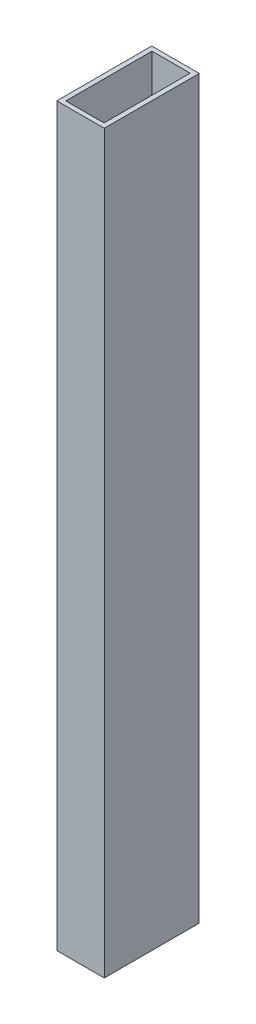
ISO-10303-21;
HEADER;
FILE_DESCRIPTION(('STEP AP214'),'2;1');
FILE_NAME('part.step','',(''),(''),'','','');
FILE_SCHEMA(('AUTOMOTIVE_DESIGN { 1 0 10303 214 1 1 1 1 }'));
ENDSEC;
DATA;
#1=APPLICATION_CONTEXT('core data for automotive mechanical design processes');
#2=APPLICATION_PROTOCOL_DEFINITION('international standard','automotive_design',2000,#1);
#3=PRODUCT_CONTEXT('',#1,'mechanical');
#4=PRODUCT('Part','Part','',(#3));
#5=PRODUCT_RELATED_PRODUCT_CATEGORY('part','',(#4));
#6=PRODUCT_DEFINITION_FORMATION('','',#4);
#7=PRODUCT_DEFINITION_CONTEXT('part definition',#1,'design');
#8=PRODUCT_DEFINITION('design','',#6,#7);
#9=PRODUCT_DEFINITION_SHAPE('','',#8);
#10=(LENGTH_UNIT() NAMED_UNIT(*) SI_UNIT(.MILLI.,.METRE.));
#11=(NAMED_UNIT(*) PLANE_ANGLE_UNIT() SI_UNIT($,.RADIAN.));
#12=(NAMED_UNIT(*) SI_UNIT($,.STERADIAN.) SOLID_ANGLE_UNIT());
#13=UNCERTAINTY_MEASURE_WITH_UNIT(LENGTH_MEASURE(1.E-05),#10,'distance_accuracy_value','');
#14=(GEOMETRIC_REPRESENTATION_CONTEXT(3) GLOBAL_UNCERTAINTY_ASSIGNED_CONTEXT((#13)) GLOBAL_UNIT_ASSIGNED_CONTEXT((#10,
#11,#12)) REPRESENTATION_CONTEXT('',''));
#15=CARTESIAN_POINT('',(0.,0.,0.));
#16=DIRECTION('',(0.,0.,1.));
#17=DIRECTION('',(1.,0.,0.));
#18=AXIS2_PLACEMENT_3D('',#15,#16,#17);
#19=CARTESIAN_POINT('',(0.,393.7,0.));
#20=DIRECTION('',(0.,-1.,0.));
#21=DIRECTION('',(0.,0.,-1.));
#22=AXIS2_PLACEMENT_3D('',#19,#20,#21);
#23=PLANE('',#22);
#24=DIRECTION('',(0.,0.,-1.));
#25=VECTOR('',#24,1.);
#26=CARTESIAN_POINT('',(15.4285360824743,393.7,25.104006109202));
#27=LINE('',#26,#25);
#28=CARTESIAN_POINT('',(15.4285360824743,393.7,25.104006109202));
#29=VERTEX_POINT('',#28);
#30=CARTESIAN_POINT('',(15.4285360824743,393.7,-25.695993890798));
#31=VERTEX_POINT('',#30);
#32=EDGE_CURVE('E136',#29,#31,#27,.T.);
#33=ORIENTED_EDGE('',*,*,#32,.T.);
#34=DIRECTION('',(-1.,0.,0.));
#35=VECTOR('',#34,1.);
#36=CARTESIAN_POINT('',(-9.97146391752574,393.7,-25.695993890798));
#37=LINE('',#36,#35);
#38=CARTESIAN_POINT('',(-9.97146391752574,393.7,-25.695993890798));
#39=VERTEX_POINT('',#38);
#40=EDGE_CURVE('E139',#31,#39,#37,.T.);
#41=ORIENTED_EDGE('',*,*,#40,.T.);
#42=DIRECTION('',(0.,0.,1.));
#43=VECTOR('',#42,1.);
#44=CARTESIAN_POINT('',(-9.97146391752574,393.7,25.104006109202));
#45=LINE('',#44,#43);
#46=CARTESIAN_POINT('',(-9.97146391752574,393.7,25.104006109202));
#47=VERTEX_POINT('',#46);
#48=EDGE_CURVE('E142',#39,#47,#45,.T.);
#49=ORIENTED_EDGE('',*,*,#48,.T.);
#50=DIRECTION('',(1.,0.,0.));
#51=VECTOR('',#50,1.);
#52=CARTESIAN_POINT('',(-9.97146391752574,393.7,25.104006109202));
#53=LINE('',#52,#51);
#54=EDGE_CURVE('E144',#47,#29,#53,.T.);
#55=ORIENTED_EDGE('',*,*,#54,.T.);
#56=EDGE_LOOP('',(#33,#41,#49,#55));
#57=FACE_BOUND('',#56,.T.);
#58=DIRECTION('',(0.,0.,-1.));
#59=VECTOR('',#58,1.);
#60=CARTESIAN_POINT('',(12.9079329813631,393.7,0.));
#61=LINE('',#60,#59);
#62=CARTESIAN_POINT('',(12.9079329813631,393.7,22.7317882900888));
#63=VERTEX_POINT('',#62);
#64=CARTESIAN_POINT('',(12.9079329813631,393.7,-23.3858455277616));
#65=VERTEX_POINT('',#64);
#66=EDGE_CURVE('E103',#63,#65,#61,.T.);
#67=ORIENTED_EDGE('',*,*,#66,.F.);
#68=DIRECTION('',(1.,0.,0.));
#69=VECTOR('',#68,1.);
#70=CARTESIAN_POINT('',(0.,393.7,22.7317882900888));
#71=LINE('',#70,#69);
#72=CARTESIAN_POINT('',(-7.51293012600225,393.7,22.7317882900888));
#73=VERTEX_POINT('',#72);
#74=EDGE_CURVE('E106',#73,#63,#71,.T.);
#75=ORIENTED_EDGE('',*,*,#74,.F.);
#76=DIRECTION('',(0.,0.,1.));
#77=VECTOR('',#76,1.);
#78=CARTESIAN_POINT('',(-7.51293012600225,393.7,0.));
#79=LINE('',#78,#77);
#80=CARTESIAN_POINT('',(-7.51293012600225,393.7,-23.3858455277616));
#81=VERTEX_POINT('',#80);
#82=EDGE_CURVE('E130',#81,#73,#79,.T.);
#83=ORIENTED_EDGE('',*,*,#82,.F.);
#84=DIRECTION('',(-1.,0.,0.));
#85=VECTOR('',#84,1.);
#86=CARTESIAN_POINT('',(0.,393.7,-23.3858455277616));
#87=LINE('',#86,#85);
#88=EDGE_CURVE('E132',#65,#81,#87,.T.);
#89=ORIENTED_EDGE('',*,*,#88,.F.);
#90=EDGE_LOOP('',(#67,#75,#83,#89));
#91=FACE_BOUND('',#90,.T.);
#92=ADVANCED_FACE('F35',(#57,#91),#23,.F.);
#93=CARTESIAN_POINT('',(0.,0.,0.));
#94=DIRECTION('',(0.,-1.,0.));
#95=DIRECTION('',(0.,0.,-1.));
#96=AXIS2_PLACEMENT_3D('',#93,#94,#95);
#97=PLANE('',#96);
#98=DIRECTION('',(0.,0.,-1.));
#99=VECTOR('',#98,1.);
#100=CARTESIAN_POINT('',(15.4285360824743,0.,25.104006109202));
#101=LINE('',#100,#99);
#102=CARTESIAN_POINT('',(15.4285360824743,0.,25.104006109202));
#103=VERTEX_POINT('',#102);
#104=CARTESIAN_POINT('',(15.4285360824743,0.,-25.695993890798));
#105=VERTEX_POINT('',#104);
#106=EDGE_CURVE('E135',#103,#105,#101,.T.);
#107=ORIENTED_EDGE('',*,*,#106,.F.);
#108=DIRECTION('',(1.,0.,0.));
#109=VECTOR('',#108,1.);
#110=CARTESIAN_POINT('',(-9.97146391752574,0.,25.104006109202));
#111=LINE('',#110,#109);
#112=CARTESIAN_POINT('',(-9.97146391752574,0.,25.104006109202));
#113=VERTEX_POINT('',#112);
#114=EDGE_CURVE('E140',#113,#103,#111,.T.);
#115=ORIENTED_EDGE('',*,*,#114,.F.);
#116=DIRECTION('',(0.,0.,1.));
#117=VECTOR('',#116,1.);
#118=CARTESIAN_POINT('',(-9.97146391752574,0.,25.104006109202));
#119=LINE('',#118,#117);
#120=CARTESIAN_POINT('',(-9.97146391752574,0.,-25.695993890798));
#121=VERTEX_POINT('',#120);
#122=EDGE_CURVE('E151',#121,#113,#119,.T.);
#123=ORIENTED_EDGE('',*,*,#122,.F.);
#124=DIRECTION('',(-1.,0.,0.));
#125=VECTOR('',#124,1.);
#126=CARTESIAN_POINT('',(-9.97146391752574,0.,-25.695993890798));
#127=LINE('',#126,#125);
#128=EDGE_CURVE('E149',#105,#121,#127,.T.);
#129=ORIENTED_EDGE('',*,*,#128,.F.);
#130=EDGE_LOOP('',(#107,#115,#123,#129));
#131=FACE_BOUND('',#130,.T.);
#132=DIRECTION('',(1.,0.,0.));
#133=VECTOR('',#132,1.);
#134=CARTESIAN_POINT('',(-7.51293012600225,0.,22.7317882900888));
#135=LINE('',#134,#133);
#136=CARTESIAN_POINT('',(-7.51293012600225,0.,22.7317882900888));
#137=VERTEX_POINT('',#136);
#138=CARTESIAN_POINT('',(12.9079329813631,0.,22.7317882900888));
#139=VERTEX_POINT('',#138);
#140=EDGE_CURVE('E120',#137,#139,#135,.T.);
#141=ORIENTED_EDGE('',*,*,#140,.T.);
#142=DIRECTION('',(0.,0.,-1.));
#143=VECTOR('',#142,1.);
#144=CARTESIAN_POINT('',(12.9079329813631,0.,22.7317882900888));
#145=LINE('',#144,#143);
#146=CARTESIAN_POINT('',(12.9079329813631,0.,-23.3858455277616));
#147=VERTEX_POINT('',#146);
#148=EDGE_CURVE('E58',#139,#147,#145,.T.);
#149=ORIENTED_EDGE('',*,*,#148,.T.);
#150=DIRECTION('',(-1.,0.,0.));
#151=VECTOR('',#150,1.);
#152=CARTESIAN_POINT('',(-7.51293012600225,0.,-23.3858455277616));
#153=LINE('',#152,#151);
#154=CARTESIAN_POINT('',(-7.51293012600225,0.,-23.3858455277616));
#155=VERTEX_POINT('',#154);
#156=EDGE_CURVE('E110',#147,#155,#153,.T.);
#157=ORIENTED_EDGE('',*,*,#156,.T.);
#158=DIRECTION('',(0.,0.,1.));
#159=VECTOR('',#158,1.);
#160=CARTESIAN_POINT('',(-7.51293012600225,0.,22.7317882900888));
#161=LINE('',#160,#159);
#162=EDGE_CURVE('E116',#155,#137,#161,.T.);
#163=ORIENTED_EDGE('',*,*,#162,.T.);
#164=EDGE_LOOP('',(#141,#149,#157,#163));
#165=FACE_BOUND('',#164,.T.);
#166=ADVANCED_FACE('F119',(#131,#165),#97,.T.);
#167=CARTESIAN_POINT('',(15.4285360824743,393.7,25.104006109202));
#168=DIRECTION('',(-1.,0.,0.));
#169=DIRECTION('',(0.,0.,1.));
#170=AXIS2_PLACEMENT_3D('',#167,#168,#169);
#171=PLANE('',#170);
#172=ORIENTED_EDGE('',*,*,#106,.T.);
#173=DIRECTION('',(0.,-1.,0.));
#174=VECTOR('',#173,1.);
#175=CARTESIAN_POINT('',(15.4285360824743,393.7,-25.695993890798));
#176=LINE('',#175,#174);
#177=EDGE_CURVE('E11',#31,#105,#176,.T.);
#178=ORIENTED_EDGE('',*,*,#177,.F.);
#179=ORIENTED_EDGE('',*,*,#32,.F.);
#180=DIRECTION('',(0.,-1.,0.));
#181=VECTOR('',#180,1.);
#182=CARTESIAN_POINT('',(15.4285360824743,393.7,25.104006109202));
#183=LINE('',#182,#181);
#184=EDGE_CURVE('E146',#29,#103,#183,.T.);
#185=ORIENTED_EDGE('',*,*,#184,.T.);
#186=EDGE_LOOP('',(#172,#178,#179,#185));
#187=FACE_BOUND('',#186,.T.);
#188=ADVANCED_FACE('F37',(#187),#171,.F.);
#189=CARTESIAN_POINT('',(-9.97146391752574,393.7,-25.695993890798));
#190=DIRECTION('',(0.,0.,1.));
#191=DIRECTION('',(1.,0.,0.));
#192=AXIS2_PLACEMENT_3D('',#189,#190,#191);
#193=PLANE('',#192);
#194=ORIENTED_EDGE('',*,*,#128,.T.);
#195=DIRECTION('',(0.,-1.,0.));
#196=VECTOR('',#195,1.);
#197=CARTESIAN_POINT('',(-9.97146391752574,393.7,-25.695993890798));
#198=LINE('',#197,#196);
#199=EDGE_CURVE('E43',#39,#121,#198,.T.);
#200=ORIENTED_EDGE('',*,*,#199,.F.);
#201=ORIENTED_EDGE('',*,*,#40,.F.);
#202=ORIENTED_EDGE('',*,*,#177,.T.);
#203=EDGE_LOOP('',(#194,#200,#201,#202));
#204=FACE_BOUND('',#203,.T.);
#205=ADVANCED_FACE('F178',(#204),#193,.F.);
#206=CARTESIAN_POINT('',(-9.97146391752574,393.7,25.104006109202));
#207=DIRECTION('',(1.,0.,0.));
#208=DIRECTION('',(0.,0.,-1.));
#209=AXIS2_PLACEMENT_3D('',#206,#207,#208);
#210=PLANE('',#209);
#211=ORIENTED_EDGE('',*,*,#122,.T.);
#212=DIRECTION('',(0.,-1.,0.));
#213=VECTOR('',#212,1.);
#214=CARTESIAN_POINT('',(-9.97146391752574,393.7,25.104006109202));
#215=LINE('',#214,#213);
#216=EDGE_CURVE('E156',#47,#113,#215,.T.);
#217=ORIENTED_EDGE('',*,*,#216,.F.);
#218=ORIENTED_EDGE('',*,*,#48,.F.);
#219=ORIENTED_EDGE('',*,*,#199,.T.);
#220=EDGE_LOOP('',(#211,#217,#218,#219));
#221=FACE_BOUND('',#220,.T.);
#222=ADVANCED_FACE('F163',(#221),#210,.F.);
#223=CARTESIAN_POINT('',(-9.97146391752574,393.7,25.104006109202));
#224=DIRECTION('',(0.,0.,-1.));
#225=DIRECTION('',(-1.,0.,0.));
#226=AXIS2_PLACEMENT_3D('',#223,#224,#225);
#227=PLANE('',#226);
#228=ORIENTED_EDGE('',*,*,#114,.T.);
#229=ORIENTED_EDGE('',*,*,#184,.F.);
#230=ORIENTED_EDGE('',*,*,#54,.F.);
#231=ORIENTED_EDGE('',*,*,#216,.T.);
#232=EDGE_LOOP('',(#228,#229,#230,#231));
#233=FACE_BOUND('',#232,.T.);
#234=ADVANCED_FACE('F171',(#233),#227,.F.);
#235=CARTESIAN_POINT('',(12.9079329813631,403.7,22.7317882900888));
#236=DIRECTION('',(-1.,0.,0.));
#237=DIRECTION('',(0.,0.,1.));
#238=AXIS2_PLACEMENT_3D('',#235,#236,#237);
#239=PLANE('',#238);
#240=ORIENTED_EDGE('',*,*,#66,.T.);
#241=DIRECTION('',(0.,-1.,0.));
#242=VECTOR('',#241,1.);
#243=CARTESIAN_POINT('',(12.9079329813631,403.7,-23.3858455277616));
#244=LINE('',#243,#242);
#245=EDGE_CURVE('E99',#65,#147,#244,.T.);
#246=ORIENTED_EDGE('',*,*,#245,.T.);
#247=ORIENTED_EDGE('',*,*,#148,.F.);
#248=DIRECTION('',(0.,-1.,0.));
#249=VECTOR('',#248,1.);
#250=CARTESIAN_POINT('',(12.9079329813631,403.7,22.7317882900888));
#251=LINE('',#250,#249);
#252=EDGE_CURVE('E125',#63,#139,#251,.T.);
#253=ORIENTED_EDGE('',*,*,#252,.F.);
#254=EDGE_LOOP('',(#240,#246,#247,#253));
#255=FACE_BOUND('',#254,.T.);
#256=ADVANCED_FACE('F101',(#255),#239,.T.);
#257=CARTESIAN_POINT('',(-7.51293012600225,403.7,-23.3858455277616));
#258=DIRECTION('',(0.,0.,1.));
#259=DIRECTION('',(1.,0.,0.));
#260=AXIS2_PLACEMENT_3D('',#257,#258,#259);
#261=PLANE('',#260);
#262=ORIENTED_EDGE('',*,*,#88,.T.);
#263=DIRECTION('',(0.,-1.,0.));
#264=VECTOR('',#263,1.);
#265=CARTESIAN_POINT('',(-7.51293012600225,403.7,-23.3858455277616));
#266=LINE('',#265,#264);
#267=EDGE_CURVE('E107',#81,#155,#266,.T.);
#268=ORIENTED_EDGE('',*,*,#267,.T.);
#269=ORIENTED_EDGE('',*,*,#156,.F.);
#270=ORIENTED_EDGE('',*,*,#245,.F.);
#271=EDGE_LOOP('',(#262,#268,#269,#270));
#272=FACE_BOUND('',#271,.T.);
#273=ADVANCED_FACE('F111',(#272),#261,.T.);
#274=CARTESIAN_POINT('',(-7.51293012600225,403.7,22.7317882900888));
#275=DIRECTION('',(1.,0.,0.));
#276=DIRECTION('',(0.,0.,-1.));
#277=AXIS2_PLACEMENT_3D('',#274,#275,#276);
#278=PLANE('',#277);
#279=ORIENTED_EDGE('',*,*,#82,.T.);
#280=DIRECTION('',(0.,-1.,0.));
#281=VECTOR('',#280,1.);
#282=CARTESIAN_POINT('',(-7.51293012600225,403.7,22.7317882900888));
#283=LINE('',#282,#281);
#284=EDGE_CURVE('E50',#73,#137,#283,.T.);
#285=ORIENTED_EDGE('',*,*,#284,.T.);
#286=ORIENTED_EDGE('',*,*,#162,.F.);
#287=ORIENTED_EDGE('',*,*,#267,.F.);
#288=EDGE_LOOP('',(#279,#285,#286,#287));
#289=FACE_BOUND('',#288,.T.);
#290=ADVANCED_FACE('F201',(#289),#278,.T.);
#291=CARTESIAN_POINT('',(-7.51293012600225,403.7,22.7317882900888));
#292=DIRECTION('',(0.,0.,-1.));
#293=DIRECTION('',(-1.,0.,0.));
#294=AXIS2_PLACEMENT_3D('',#291,#292,#293);
#295=PLANE('',#294);
#296=ORIENTED_EDGE('',*,*,#74,.T.);
#297=ORIENTED_EDGE('',*,*,#252,.T.);
#298=ORIENTED_EDGE('',*,*,#140,.F.);
#299=ORIENTED_EDGE('',*,*,#284,.F.);
#300=EDGE_LOOP('',(#296,#297,#298,#299));
#301=FACE_BOUND('',#300,.T.);
#302=ADVANCED_FACE('F205',(#301),#295,.T.);
#303=CLOSED_SHELL('',(#92,#166,#188,#205,#222,#234,#256,#273,#290,#302));
#304=MANIFOLD_SOLID_BREP('B2',#303);
#305=ADVANCED_BREP_SHAPE_REPRESENTATION('',(#18,#304),#14);
#306=SHAPE_DEFINITION_REPRESENTATION(#9,#305);
ENDSEC;
END-ISO-10303-21;
